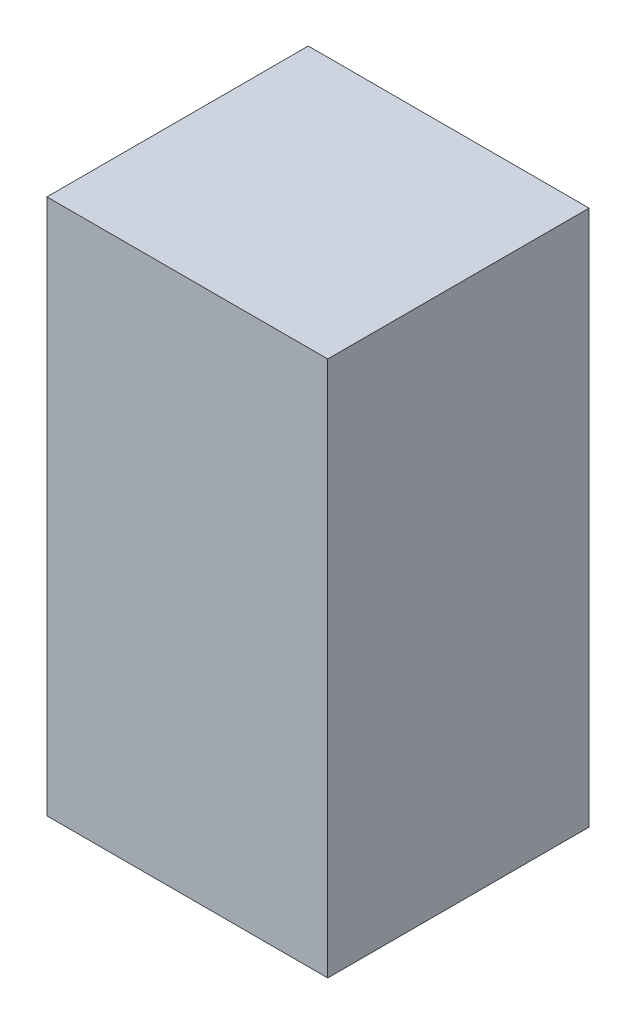
ISO-10303-21;
HEADER;
FILE_DESCRIPTION(('STEP AP214'),'2;1');
FILE_NAME('part.step','',(''),(''),'','','');
FILE_SCHEMA(('AUTOMOTIVE_DESIGN { 1 0 10303 214 1 1 1 1 }'));
ENDSEC;
DATA;
#1=APPLICATION_CONTEXT('core data for automotive mechanical design processes');
#2=APPLICATION_PROTOCOL_DEFINITION('international standard','automotive_design',2000,#1);
#3=PRODUCT_CONTEXT('',#1,'mechanical');
#4=PRODUCT('Part','Part','',(#3));
#5=PRODUCT_RELATED_PRODUCT_CATEGORY('part','',(#4));
#6=PRODUCT_DEFINITION_FORMATION('','',#4);
#7=PRODUCT_DEFINITION_CONTEXT('part definition',#1,'design');
#8=PRODUCT_DEFINITION('design','',#6,#7);
#9=PRODUCT_DEFINITION_SHAPE('','',#8);
#10=(LENGTH_UNIT() NAMED_UNIT(*) SI_UNIT(.MILLI.,.METRE.));
#11=(NAMED_UNIT(*) PLANE_ANGLE_UNIT() SI_UNIT($,.RADIAN.));
#12=(NAMED_UNIT(*) SI_UNIT($,.STERADIAN.) SOLID_ANGLE_UNIT());
#13=UNCERTAINTY_MEASURE_WITH_UNIT(LENGTH_MEASURE(1.E-05),#10,'distance_accuracy_value','');
#14=(GEOMETRIC_REPRESENTATION_CONTEXT(3) GLOBAL_UNCERTAINTY_ASSIGNED_CONTEXT((#13)) GLOBAL_UNIT_ASSIGNED_CONTEXT((#10,
#11,#12)) REPRESENTATION_CONTEXT('',''));
#15=CARTESIAN_POINT('',(0.,0.,0.));
#16=DIRECTION('',(0.,0.,1.));
#17=DIRECTION('',(1.,0.,0.));
#18=AXIS2_PLACEMENT_3D('',#15,#16,#17);
#19=CARTESIAN_POINT('',(1.397,-2.667,2.59999988));
#20=DIRECTION('',(0.,0.,1.));
#21=DIRECTION('',(1.,0.,0.));
#22=AXIS2_PLACEMENT_3D('',#19,#20,#21);
#23=PLANE('',#22);
#24=DIRECTION('',(0.,1.,0.));
#25=VECTOR('',#24,1.);
#26=CARTESIAN_POINT('',(-1.397,-2.667,2.59999988));
#27=LINE('',#26,#25);
#28=CARTESIAN_POINT('',(-1.397,-2.667,2.59999988));
#29=VERTEX_POINT('',#28);
#30=CARTESIAN_POINT('',(-1.397,2.667,2.59999988));
#31=VERTEX_POINT('',#30);
#32=EDGE_CURVE('E53',#29,#31,#27,.T.);
#33=ORIENTED_EDGE('',*,*,#32,.F.);
#34=DIRECTION('',(1.,0.,0.));
#35=VECTOR('',#34,1.);
#36=CARTESIAN_POINT('',(1.397,-2.667,2.59999988));
#37=LINE('',#36,#35);
#38=CARTESIAN_POINT('',(1.397,-2.667,2.59999988));
#39=VERTEX_POINT('',#38);
#40=EDGE_CURVE('E68',#39,#29,#37,.F.);
#41=ORIENTED_EDGE('',*,*,#40,.F.);
#42=DIRECTION('',(0.,1.,0.));
#43=VECTOR('',#42,1.);
#44=CARTESIAN_POINT('',(1.397,2.667,2.59999988));
#45=LINE('',#44,#43);
#46=CARTESIAN_POINT('',(1.397,2.667,2.59999988));
#47=VERTEX_POINT('',#46);
#48=EDGE_CURVE('E20',#47,#39,#45,.F.);
#49=ORIENTED_EDGE('',*,*,#48,.F.);
#50=DIRECTION('',(1.,0.,0.));
#51=VECTOR('',#50,1.);
#52=CARTESIAN_POINT('',(-1.397,2.667,2.59999988));
#53=LINE('',#52,#51);
#54=EDGE_CURVE('E58',#31,#47,#53,.T.);
#55=ORIENTED_EDGE('',*,*,#54,.F.);
#56=EDGE_LOOP('',(#33,#41,#49,#55));
#57=FACE_BOUND('',#56,.T.);
#58=ADVANCED_FACE('F17',(#57),#23,.T.);
#59=CARTESIAN_POINT('',(1.397,2.667,0.));
#60=DIRECTION('',(1.,0.,0.));
#61=DIRECTION('',(0.,0.,-1.));
#62=AXIS2_PLACEMENT_3D('',#59,#60,#61);
#63=PLANE('',#62);
#64=DIRECTION('',(0.,0.,-1.));
#65=VECTOR('',#64,1.);
#66=CARTESIAN_POINT('',(1.397,-2.667,0.));
#67=LINE('',#66,#65);
#68=CARTESIAN_POINT('',(1.397,-2.667,0.));
#69=VERTEX_POINT('',#68);
#70=EDGE_CURVE('E79',#69,#39,#67,.F.);
#71=ORIENTED_EDGE('',*,*,#70,.F.);
#72=DIRECTION('',(0.,1.,0.));
#73=VECTOR('',#72,1.);
#74=CARTESIAN_POINT('',(1.397,-2.667,0.));
#75=LINE('',#74,#73);
#76=CARTESIAN_POINT('',(1.397,2.667,0.));
#77=VERTEX_POINT('',#76);
#78=EDGE_CURVE('E74',#69,#77,#75,.T.);
#79=ORIENTED_EDGE('',*,*,#78,.T.);
#80=DIRECTION('',(0.,0.,1.));
#81=VECTOR('',#80,1.);
#82=CARTESIAN_POINT('',(1.397,2.667,0.));
#83=LINE('',#82,#81);
#84=EDGE_CURVE('E63',#47,#77,#83,.F.);
#85=ORIENTED_EDGE('',*,*,#84,.F.);
#86=ORIENTED_EDGE('',*,*,#48,.T.);
#87=EDGE_LOOP('',(#71,#79,#85,#86));
#88=FACE_BOUND('',#87,.T.);
#89=ADVANCED_FACE('F73',(#88),#63,.T.);
#90=CARTESIAN_POINT('',(-1.397,2.667,0.));
#91=DIRECTION('',(0.,1.,0.));
#92=DIRECTION('',(0.,0.,1.));
#93=AXIS2_PLACEMENT_3D('',#90,#91,#92);
#94=PLANE('',#93);
#95=ORIENTED_EDGE('',*,*,#84,.T.);
#96=DIRECTION('',(1.,0.,0.));
#97=VECTOR('',#96,1.);
#98=CARTESIAN_POINT('',(1.397,2.667,0.));
#99=LINE('',#98,#97);
#100=CARTESIAN_POINT('',(-1.397,2.667,0.));
#101=VERTEX_POINT('',#100);
#102=EDGE_CURVE('E84',#77,#101,#99,.F.);
#103=ORIENTED_EDGE('',*,*,#102,.T.);
#104=DIRECTION('',(0.,0.,1.));
#105=VECTOR('',#104,1.);
#106=CARTESIAN_POINT('',(-1.397,2.667,0.));
#107=LINE('',#106,#105);
#108=EDGE_CURVE('E65',#31,#101,#107,.F.);
#109=ORIENTED_EDGE('',*,*,#108,.F.);
#110=ORIENTED_EDGE('',*,*,#54,.T.);
#111=EDGE_LOOP('',(#95,#103,#109,#110));
#112=FACE_BOUND('',#111,.T.);
#113=ADVANCED_FACE('F60',(#112),#94,.T.);
#114=CARTESIAN_POINT('',(-1.397,-2.667,0.));
#115=DIRECTION('',(-1.,0.,0.));
#116=DIRECTION('',(0.,0.,1.));
#117=AXIS2_PLACEMENT_3D('',#114,#115,#116);
#118=PLANE('',#117);
#119=ORIENTED_EDGE('',*,*,#108,.T.);
#120=DIRECTION('',(0.,1.,0.));
#121=VECTOR('',#120,1.);
#122=CARTESIAN_POINT('',(-1.397,-2.667,0.));
#123=LINE('',#122,#121);
#124=CARTESIAN_POINT('',(-1.397,-2.667,0.));
#125=VERTEX_POINT('',#124);
#126=EDGE_CURVE('E26',#101,#125,#123,.F.);
#127=ORIENTED_EDGE('',*,*,#126,.T.);
#128=DIRECTION('',(0.,0.,-1.));
#129=VECTOR('',#128,1.);
#130=CARTESIAN_POINT('',(-1.397,-2.667,0.));
#131=LINE('',#130,#129);
#132=EDGE_CURVE('E34',#29,#125,#131,.T.);
#133=ORIENTED_EDGE('',*,*,#132,.F.);
#134=ORIENTED_EDGE('',*,*,#32,.T.);
#135=EDGE_LOOP('',(#119,#127,#133,#134));
#136=FACE_BOUND('',#135,.T.);
#137=ADVANCED_FACE('F88',(#136),#118,.T.);
#138=CARTESIAN_POINT('',(1.397,-2.667,0.));
#139=DIRECTION('',(0.,-1.,0.));
#140=DIRECTION('',(0.,0.,-1.));
#141=AXIS2_PLACEMENT_3D('',#138,#139,#140);
#142=PLANE('',#141);
#143=ORIENTED_EDGE('',*,*,#132,.T.);
#144=DIRECTION('',(1.,0.,0.));
#145=VECTOR('',#144,1.);
#146=CARTESIAN_POINT('',(1.397,-2.667,0.));
#147=LINE('',#146,#145);
#148=EDGE_CURVE('E11',#125,#69,#147,.T.);
#149=ORIENTED_EDGE('',*,*,#148,.T.);
#150=ORIENTED_EDGE('',*,*,#70,.T.);
#151=ORIENTED_EDGE('',*,*,#40,.T.);
#152=EDGE_LOOP('',(#143,#149,#150,#151));
#153=FACE_BOUND('',#152,.T.);
#154=ADVANCED_FACE('F91',(#153),#142,.T.);
#155=CARTESIAN_POINT('',(1.397,-2.667,0.));
#156=DIRECTION('',(0.,0.,1.));
#157=DIRECTION('',(1.,0.,0.));
#158=AXIS2_PLACEMENT_3D('',#155,#156,#157);
#159=PLANE('',#158);
#160=ORIENTED_EDGE('',*,*,#126,.F.);
#161=ORIENTED_EDGE('',*,*,#102,.F.);
#162=ORIENTED_EDGE('',*,*,#78,.F.);
#163=ORIENTED_EDGE('',*,*,#148,.F.);
#164=EDGE_LOOP('',(#160,#161,#162,#163));
#165=FACE_BOUND('',#164,.T.);
#166=ADVANCED_FACE('F90',(#165),#159,.F.);
#167=CLOSED_SHELL('',(#58,#89,#113,#137,#154,#166));
#168=MANIFOLD_SOLID_BREP('B1',#167);
#169=ADVANCED_BREP_SHAPE_REPRESENTATION('',(#18,#168),#14);
#170=SHAPE_DEFINITION_REPRESENTATION(#9,#169);
ENDSEC;
END-ISO-10303-21;
